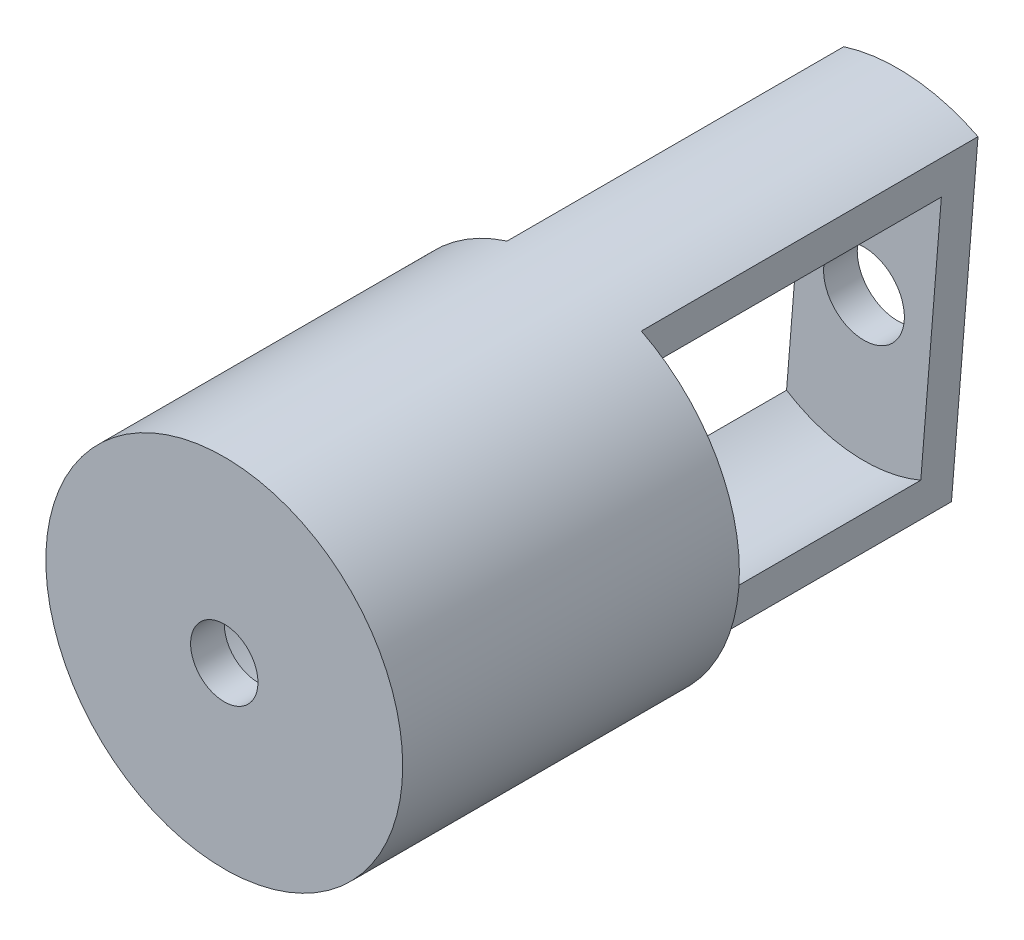
ISO-10303-21;
HEADER;
FILE_DESCRIPTION(('STEP AP214'),'2;1');
FILE_NAME('part.step','',(''),(''),'','','');
FILE_SCHEMA(('AUTOMOTIVE_DESIGN { 1 0 10303 214 1 1 1 1 }'));
ENDSEC;
DATA;
#1=APPLICATION_CONTEXT('core data for automotive mechanical design processes');
#2=APPLICATION_PROTOCOL_DEFINITION('international standard','automotive_design',2000,#1);
#3=PRODUCT_CONTEXT('',#1,'mechanical');
#4=PRODUCT('Part','Part','',(#3));
#5=PRODUCT_RELATED_PRODUCT_CATEGORY('part','',(#4));
#6=PRODUCT_DEFINITION_FORMATION('','',#4);
#7=PRODUCT_DEFINITION_CONTEXT('part definition',#1,'design');
#8=PRODUCT_DEFINITION('design','',#6,#7);
#9=PRODUCT_DEFINITION_SHAPE('','',#8);
#10=(LENGTH_UNIT() NAMED_UNIT(*) SI_UNIT(.MILLI.,.METRE.));
#11=(NAMED_UNIT(*) PLANE_ANGLE_UNIT() SI_UNIT($,.RADIAN.));
#12=(NAMED_UNIT(*) SI_UNIT($,.STERADIAN.) SOLID_ANGLE_UNIT());
#13=UNCERTAINTY_MEASURE_WITH_UNIT(LENGTH_MEASURE(1.E-05),#10,'distance_accuracy_value','');
#14=(GEOMETRIC_REPRESENTATION_CONTEXT(3) GLOBAL_UNCERTAINTY_ASSIGNED_CONTEXT((#13)) GLOBAL_UNIT_ASSIGNED_CONTEXT((#10,
#11,#12)) REPRESENTATION_CONTEXT('',''));
#15=CARTESIAN_POINT('',(0.,0.,0.));
#16=DIRECTION('',(0.,0.,1.));
#17=DIRECTION('',(1.,0.,0.));
#18=AXIS2_PLACEMENT_3D('',#15,#16,#17);
#19=CARTESIAN_POINT('',(0.,0.,-95.));
#20=DIRECTION('',(0.,0.,1.));
#21=DIRECTION('',(1.,0.,0.));
#22=AXIS2_PLACEMENT_3D('',#19,#20,#21);
#23=CYLINDRICAL_SURFACE('',#22,21.5);
#24=CARTESIAN_POINT('',(0.,0.,0.));
#25=DIRECTION('',(0.,0.,1.));
#26=DIRECTION('',(1.,0.,0.));
#27=AXIS2_PLACEMENT_3D('',#24,#25,#26);
#28=CIRCLE('',#27,21.5);
#29=CARTESIAN_POINT('',(21.5,0.,0.));
#30=VERTEX_POINT('',#29);
#31=EDGE_CURVE('E12',#30,#30,#28,.T.);
#32=ORIENTED_EDGE('',*,*,#31,.T.);
#33=EDGE_LOOP('',(#32));
#34=FACE_BOUND('',#33,.T.);
#35=CARTESIAN_POINT('',(0.,0.,-90.));
#36=DIRECTION('',(0.,0.,-1.));
#37=DIRECTION('',(-1.,0.,0.));
#38=AXIS2_PLACEMENT_3D('',#35,#36,#37);
#39=CIRCLE('',#38,21.5);
#40=CARTESIAN_POINT('',(-11.4948270092321,-18.1691758764075,-90.));
#41=VERTEX_POINT('',#40);
#42=CARTESIAN_POINT('',(8.4406955661325,-19.7738377246267,-90.));
#43=VERTEX_POINT('',#42);
#44=EDGE_CURVE('E56',#41,#43,#39,.F.);
#45=ORIENTED_EDGE('',*,*,#44,.F.);
#46=DIRECTION('',(0.,0.,-1.));
#47=VECTOR('',#46,1.);
#48=CARTESIAN_POINT('',(-11.4948270092321,-18.1691758764075,-45.));
#49=LINE('',#48,#47);
#50=CARTESIAN_POINT('',(-11.4948270092321,-18.1691758764075,-45.));
#51=VERTEX_POINT('',#50);
#52=EDGE_CURVE('E121',#51,#41,#49,.T.);
#53=ORIENTED_EDGE('',*,*,#52,.F.);
#54=CARTESIAN_POINT('',(0.,0.,-45.));
#55=DIRECTION('',(0.,0.,1.));
#56=DIRECTION('',(-1.,0.,0.));
#57=AXIS2_PLACEMENT_3D('',#54,#55,#56);
#58=CIRCLE('',#57,21.5);
#59=CARTESIAN_POINT('',(-8.4406955661325,19.7738377246267,-45.));
#60=VERTEX_POINT('',#59);
#61=EDGE_CURVE('E126',#60,#51,#58,.T.);
#62=ORIENTED_EDGE('',*,*,#61,.F.);
#63=DIRECTION('',(0.,0.,-1.));
#64=VECTOR('',#63,1.);
#65=CARTESIAN_POINT('',(-8.4406955661325,19.7738377246267,-45.));
#66=LINE('',#65,#64);
#67=CARTESIAN_POINT('',(-8.44069556613249,19.7738377246267,-90.));
#68=VERTEX_POINT('',#67);
#69=EDGE_CURVE('E119',#60,#68,#66,.T.);
#70=ORIENTED_EDGE('',*,*,#69,.T.);
#71=CARTESIAN_POINT('',(0.,0.,-90.));
#72=DIRECTION('',(0.,0.,-1.));
#73=DIRECTION('',(-1.,0.,0.));
#74=AXIS2_PLACEMENT_3D('',#71,#72,#73);
#75=CIRCLE('',#74,21.5);
#76=CARTESIAN_POINT('',(11.494827009232,18.1691758764075,-90.));
#77=VERTEX_POINT('',#76);
#78=EDGE_CURVE('E105',#68,#77,#75,.T.);
#79=ORIENTED_EDGE('',*,*,#78,.T.);
#80=DIRECTION('',(0.,0.,-1.));
#81=VECTOR('',#80,1.);
#82=CARTESIAN_POINT('',(11.494827009232,18.1691758764075,-45.));
#83=LINE('',#82,#81);
#84=CARTESIAN_POINT('',(11.494827009232,18.1691758764075,-45.));
#85=VERTEX_POINT('',#84);
#86=EDGE_CURVE('E204',#85,#77,#83,.T.);
#87=ORIENTED_EDGE('',*,*,#86,.F.);
#88=CARTESIAN_POINT('',(0.,0.,-45.));
#89=DIRECTION('',(0.,0.,1.));
#90=DIRECTION('',(-1.,0.,0.));
#91=AXIS2_PLACEMENT_3D('',#88,#89,#90);
#92=CIRCLE('',#91,21.5);
#93=CARTESIAN_POINT('',(8.4406955661325,-19.7738377246267,-45.));
#94=VERTEX_POINT('',#93);
#95=EDGE_CURVE('E223',#94,#85,#92,.T.);
#96=ORIENTED_EDGE('',*,*,#95,.F.);
#97=DIRECTION('',(0.,0.,-1.));
#98=VECTOR('',#97,1.);
#99=CARTESIAN_POINT('',(8.4406955661325,-19.7738377246267,-45.));
#100=LINE('',#99,#98);
#101=EDGE_CURVE('E61',#94,#43,#100,.T.);
#102=ORIENTED_EDGE('',*,*,#101,.T.);
#103=EDGE_LOOP('',(#45,#53,#62,#70,#79,#87,#96,#102));
#104=FACE_BOUND('',#103,.T.);
#105=ADVANCED_FACE('F41',(#34,#104),#23,.F.);
#106=CARTESIAN_POINT('',(0.,0.,5.));
#107=DIRECTION('',(0.,0.,1.));
#108=DIRECTION('',(1.,0.,0.));
#109=AXIS2_PLACEMENT_3D('',#106,#107,#108);
#110=PLANE('',#109);
#111=CARTESIAN_POINT('',(0.,0.,5.));
#112=DIRECTION('',(0.,0.,1.));
#113=DIRECTION('',(1.,0.,0.));
#114=AXIS2_PLACEMENT_3D('',#111,#112,#113);
#115=CIRCLE('',#114,5.);
#116=CARTESIAN_POINT('',(5.,0.,5.));
#117=VERTEX_POINT('',#116);
#118=EDGE_CURVE('E49',#117,#117,#115,.T.);
#119=ORIENTED_EDGE('',*,*,#118,.F.);
#120=EDGE_LOOP('',(#119));
#121=FACE_BOUND('',#120,.T.);
#122=CARTESIAN_POINT('',(0.,0.,5.));
#123=DIRECTION('',(0.,0.,1.));
#124=DIRECTION('',(1.,0.,0.));
#125=AXIS2_PLACEMENT_3D('',#122,#123,#124);
#126=CIRCLE('',#125,26.5);
#127=CARTESIAN_POINT('',(26.5,0.,5.));
#128=VERTEX_POINT('',#127);
#129=EDGE_CURVE('E147',#128,#128,#126,.T.);
#130=ORIENTED_EDGE('',*,*,#129,.T.);
#131=EDGE_LOOP('',(#130));
#132=FACE_BOUND('',#131,.T.);
#133=ADVANCED_FACE('F168',(#121,#132),#110,.T.);
#134=CARTESIAN_POINT('',(0.,0.,0.));
#135=DIRECTION('',(0.,0.,1.));
#136=DIRECTION('',(1.,0.,0.));
#137=AXIS2_PLACEMENT_3D('',#134,#135,#136);
#138=PLANE('',#137);
#139=ORIENTED_EDGE('',*,*,#31,.F.);
#140=EDGE_LOOP('',(#139));
#141=FACE_BOUND('',#140,.T.);
#142=CARTESIAN_POINT('',(0.,0.,0.));
#143=DIRECTION('',(0.,0.,1.));
#144=DIRECTION('',(1.,0.,0.));
#145=AXIS2_PLACEMENT_3D('',#142,#143,#144);
#146=CIRCLE('',#145,5.);
#147=CARTESIAN_POINT('',(5.,0.,0.));
#148=VERTEX_POINT('',#147);
#149=EDGE_CURVE('E145',#148,#148,#146,.T.);
#150=ORIENTED_EDGE('',*,*,#149,.T.);
#151=EDGE_LOOP('',(#150));
#152=FACE_BOUND('',#151,.T.);
#153=ADVANCED_FACE('F43',(#141,#152),#138,.F.);
#154=CARTESIAN_POINT('',(0.,0.,5.));
#155=DIRECTION('',(0.,0.,-1.));
#156=DIRECTION('',(-1.,0.,0.));
#157=AXIS2_PLACEMENT_3D('',#154,#155,#156);
#158=CYLINDRICAL_SURFACE('',#157,5.);
#159=ORIENTED_EDGE('',*,*,#118,.T.);
#160=EDGE_LOOP('',(#159));
#161=FACE_BOUND('',#160,.T.);
#162=ORIENTED_EDGE('',*,*,#149,.F.);
#163=EDGE_LOOP('',(#162));
#164=FACE_BOUND('',#163,.T.);
#165=ADVANCED_FACE('F156',(#161,#164),#158,.F.);
#166=CARTESIAN_POINT('',(0.,0.,-95.));
#167=DIRECTION('',(0.,0.,1.));
#168=DIRECTION('',(1.,0.,0.));
#169=AXIS2_PLACEMENT_3D('',#166,#167,#168);
#170=CYLINDRICAL_SURFACE('',#169,26.5);
#171=DIRECTION('',(0.,0.,-1.));
#172=VECTOR('',#171,1.);
#173=CARTESIAN_POINT('',(11.9367441485042,23.6593351371747,-45.));
#174=LINE('',#173,#172);
#175=CARTESIAN_POINT('',(11.9367441485042,23.6593351371747,-45.));
#176=VERTEX_POINT('',#175);
#177=CARTESIAN_POINT('',(11.9367441485042,23.6593351371747,-95.));
#178=VERTEX_POINT('',#177);
#179=EDGE_CURVE('E150',#176,#178,#174,.T.);
#180=ORIENTED_EDGE('',*,*,#179,.T.);
#181=CARTESIAN_POINT('',(0.,0.,-95.));
#182=DIRECTION('',(0.,0.,1.));
#183=DIRECTION('',(1.,0.,0.));
#184=AXIS2_PLACEMENT_3D('',#181,#182,#183);
#185=CIRCLE('',#184,26.5);
#186=CARTESIAN_POINT('',(-7.99877842686035,25.2639969853939,-95.));
#187=VERTEX_POINT('',#186);
#188=EDGE_CURVE('E142',#178,#187,#185,.T.);
#189=ORIENTED_EDGE('',*,*,#188,.T.);
#190=DIRECTION('',(0.,0.,-1.));
#191=VECTOR('',#190,1.);
#192=CARTESIAN_POINT('',(-7.99877842686035,25.2639969853939,-45.));
#193=LINE('',#192,#191);
#194=CARTESIAN_POINT('',(-7.99877842686035,25.2639969853939,-45.));
#195=VERTEX_POINT('',#194);
#196=EDGE_CURVE('E128',#195,#187,#193,.T.);
#197=ORIENTED_EDGE('',*,*,#196,.F.);
#198=CARTESIAN_POINT('',(0.,0.,-45.));
#199=DIRECTION('',(0.,0.,-1.));
#200=DIRECTION('',(-1.,0.,0.));
#201=AXIS2_PLACEMENT_3D('',#198,#199,#200);
#202=CIRCLE('',#201,26.5);
#203=CARTESIAN_POINT('',(-11.9367441485042,-23.6593351371747,-45.));
#204=VERTEX_POINT('',#203);
#205=EDGE_CURVE('E217',#204,#195,#202,.T.);
#206=ORIENTED_EDGE('',*,*,#205,.F.);
#207=DIRECTION('',(0.,0.,-1.));
#208=VECTOR('',#207,1.);
#209=CARTESIAN_POINT('',(-11.9367441485042,-23.6593351371747,-45.));
#210=LINE('',#209,#208);
#211=CARTESIAN_POINT('',(-11.9367441485042,-23.6593351371747,-95.));
#212=VERTEX_POINT('',#211);
#213=EDGE_CURVE('E132',#204,#212,#210,.T.);
#214=ORIENTED_EDGE('',*,*,#213,.T.);
#215=CARTESIAN_POINT('',(7.99877842686036,-25.2639969853939,-95.));
#216=VERTEX_POINT('',#215);
#217=EDGE_CURVE('E146',#212,#216,#185,.T.);
#218=ORIENTED_EDGE('',*,*,#217,.T.);
#219=DIRECTION('',(0.,0.,-1.));
#220=VECTOR('',#219,1.);
#221=CARTESIAN_POINT('',(7.99877842686036,-25.2639969853939,-45.));
#222=LINE('',#221,#220);
#223=CARTESIAN_POINT('',(7.99877842686036,-25.2639969853939,-45.));
#224=VERTEX_POINT('',#223);
#225=EDGE_CURVE('E210',#224,#216,#222,.T.);
#226=ORIENTED_EDGE('',*,*,#225,.F.);
#227=CARTESIAN_POINT('',(0.,0.,-45.));
#228=DIRECTION('',(0.,0.,-1.));
#229=DIRECTION('',(-1.,0.,0.));
#230=AXIS2_PLACEMENT_3D('',#227,#228,#229);
#231=CIRCLE('',#230,26.5);
#232=EDGE_CURVE('E130',#176,#224,#231,.T.);
#233=ORIENTED_EDGE('',*,*,#232,.F.);
#234=EDGE_LOOP('',(#180,#189,#197,#206,#214,#218,#226,#233));
#235=FACE_BOUND('',#234,.T.);
#236=ORIENTED_EDGE('',*,*,#129,.F.);
#237=EDGE_LOOP('',(#236));
#238=FACE_BOUND('',#237,.T.);
#239=ADVANCED_FACE('F158',(#235,#238),#170,.T.);
#240=CARTESIAN_POINT('',(0.,0.,-95.));
#241=DIRECTION('',(0.,0.,1.));
#242=DIRECTION('',(1.,0.,0.));
#243=AXIS2_PLACEMENT_3D('',#240,#241,#242);
#244=PLANE('',#243);
#245=CARTESIAN_POINT('',(0.,0.,-95.));
#246=DIRECTION('',(0.,0.,-1.));
#247=DIRECTION('',(-1.,0.,0.));
#248=AXIS2_PLACEMENT_3D('',#245,#246,#247);
#249=CIRCLE('',#248,6.);
#250=CARTESIAN_POINT('',(-6.,0.,-95.));
#251=VERTEX_POINT('',#250);
#252=EDGE_CURVE('E189',#251,#251,#249,.T.);
#253=ORIENTED_EDGE('',*,*,#252,.F.);
#254=EDGE_LOOP('',(#253));
#255=FACE_BOUND('',#254,.T.);
#256=DIRECTION('',(-0.0802330924109598,-0.996776128768228,0.));
#257=VECTOR('',#256,1.);
#258=CARTESIAN_POINT('',(-11.9367441485042,-23.6593351371747,-95.));
#259=LINE('',#258,#257);
#260=EDGE_CURVE('E135',#187,#212,#259,.T.);
#261=ORIENTED_EDGE('',*,*,#260,.F.);
#262=ORIENTED_EDGE('',*,*,#188,.F.);
#263=DIRECTION('',(0.0802330924109597,0.996776128768228,0.));
#264=VECTOR('',#263,1.);
#265=CARTESIAN_POINT('',(7.99877842686036,-25.2639969853939,-95.));
#266=LINE('',#265,#264);
#267=EDGE_CURVE('E127',#216,#178,#266,.T.);
#268=ORIENTED_EDGE('',*,*,#267,.F.);
#269=ORIENTED_EDGE('',*,*,#217,.F.);
#270=EDGE_LOOP('',(#261,#262,#268,#269));
#271=FACE_BOUND('',#270,.T.);
#272=ADVANCED_FACE('F165',(#255,#271),#244,.F.);
#273=CARTESIAN_POINT('',(-8.4406955661325,19.7738377246267,-45.));
#274=DIRECTION('',(0.996776128768228,-0.0802330924109604,0.));
#275=DIRECTION('',(0.0802330924109604,0.996776128768228,0.));
#276=AXIS2_PLACEMENT_3D('',#273,#274,#275);
#277=PLANE('',#276);
#278=ORIENTED_EDGE('',*,*,#196,.T.);
#279=ORIENTED_EDGE('',*,*,#260,.T.);
#280=ORIENTED_EDGE('',*,*,#213,.F.);
#281=DIRECTION('',(-0.0802330924109598,-0.996776128768228,0.));
#282=VECTOR('',#281,1.);
#283=CARTESIAN_POINT('',(-11.9367441485042,-23.6593351371747,-45.));
#284=LINE('',#283,#282);
#285=EDGE_CURVE('E214',#51,#204,#284,.T.);
#286=ORIENTED_EDGE('',*,*,#285,.F.);
#287=ORIENTED_EDGE('',*,*,#52,.T.);
#288=DIRECTION('',(0.08023309241096,0.996776128768228,0.));
#289=VECTOR('',#288,1.);
#290=CARTESIAN_POINT('',(-9.96776128768227,0.802330924109599,-90.));
#291=LINE('',#290,#289);
#292=EDGE_CURVE('E108',#41,#68,#291,.T.);
#293=ORIENTED_EDGE('',*,*,#292,.T.);
#294=ORIENTED_EDGE('',*,*,#69,.F.);
#295=DIRECTION('',(-0.0802330924109604,-0.996776128768228,0.));
#296=VECTOR('',#295,1.);
#297=CARTESIAN_POINT('',(-8.4406955661325,19.7738377246267,-45.));
#298=LINE('',#297,#296);
#299=EDGE_CURVE('E141',#195,#60,#298,.T.);
#300=ORIENTED_EDGE('',*,*,#299,.F.);
#301=EDGE_LOOP('',(#278,#279,#280,#286,#287,#293,#294,#300));
#302=FACE_BOUND('',#301,.T.);
#303=ADVANCED_FACE('F117',(#302),#277,.F.);
#304=CARTESIAN_POINT('',(0.,0.,-45.));
#305=DIRECTION('',(0.,0.,-1.));
#306=DIRECTION('',(-1.,0.,0.));
#307=AXIS2_PLACEMENT_3D('',#304,#305,#306);
#308=PLANE('',#307);
#309=ORIENTED_EDGE('',*,*,#61,.T.);
#310=ORIENTED_EDGE('',*,*,#285,.T.);
#311=ORIENTED_EDGE('',*,*,#205,.T.);
#312=ORIENTED_EDGE('',*,*,#299,.T.);
#313=EDGE_LOOP('',(#309,#310,#311,#312));
#314=FACE_BOUND('',#313,.T.);
#315=ADVANCED_FACE('F185',(#314),#308,.T.);
#316=CARTESIAN_POINT('',(11.494827009232,18.1691758764075,-45.));
#317=DIRECTION('',(-0.996776128768228,0.0802330924109597,0.));
#318=DIRECTION('',(-0.0802330924109597,-0.996776128768228,0.));
#319=AXIS2_PLACEMENT_3D('',#316,#317,#318);
#320=PLANE('',#319);
#321=ORIENTED_EDGE('',*,*,#267,.T.);
#322=ORIENTED_EDGE('',*,*,#179,.F.);
#323=DIRECTION('',(0.0802330924109597,0.996776128768228,0.));
#324=VECTOR('',#323,1.);
#325=CARTESIAN_POINT('',(11.494827009232,18.1691758764075,-45.));
#326=LINE('',#325,#324);
#327=EDGE_CURVE('E212',#85,#176,#326,.T.);
#328=ORIENTED_EDGE('',*,*,#327,.F.);
#329=ORIENTED_EDGE('',*,*,#86,.T.);
#330=DIRECTION('',(0.0802330924109596,0.996776128768228,0.));
#331=VECTOR('',#330,1.);
#332=CARTESIAN_POINT('',(9.96776128768227,-0.802330924109596,-90.));
#333=LINE('',#332,#331);
#334=EDGE_CURVE('E110',#43,#77,#333,.T.);
#335=ORIENTED_EDGE('',*,*,#334,.F.);
#336=ORIENTED_EDGE('',*,*,#101,.F.);
#337=DIRECTION('',(0.0802330924109597,0.996776128768228,0.));
#338=VECTOR('',#337,1.);
#339=CARTESIAN_POINT('',(7.99877842686036,-25.2639969853939,-45.));
#340=LINE('',#339,#338);
#341=EDGE_CURVE('E221',#224,#94,#340,.T.);
#342=ORIENTED_EDGE('',*,*,#341,.F.);
#343=ORIENTED_EDGE('',*,*,#225,.T.);
#344=EDGE_LOOP('',(#321,#322,#328,#329,#335,#336,#342,#343));
#345=FACE_BOUND('',#344,.T.);
#346=ADVANCED_FACE('F219',(#345),#320,.F.);
#347=CARTESIAN_POINT('',(0.,0.,-45.));
#348=DIRECTION('',(0.,0.,-1.));
#349=DIRECTION('',(-1.,0.,0.));
#350=AXIS2_PLACEMENT_3D('',#347,#348,#349);
#351=PLANE('',#350);
#352=ORIENTED_EDGE('',*,*,#232,.T.);
#353=ORIENTED_EDGE('',*,*,#341,.T.);
#354=ORIENTED_EDGE('',*,*,#95,.T.);
#355=ORIENTED_EDGE('',*,*,#327,.T.);
#356=EDGE_LOOP('',(#352,#353,#354,#355));
#357=FACE_BOUND('',#356,.T.);
#358=ADVANCED_FACE('F225',(#357),#351,.T.);
#359=CARTESIAN_POINT('',(0.,0.,-90.));
#360=DIRECTION('',(0.,0.,-1.));
#361=DIRECTION('',(-1.,0.,0.));
#362=AXIS2_PLACEMENT_3D('',#359,#360,#361);
#363=PLANE('',#362);
#364=CARTESIAN_POINT('',(0.,0.,-90.));
#365=DIRECTION('',(0.,0.,-1.));
#366=DIRECTION('',(-1.,0.,0.));
#367=AXIS2_PLACEMENT_3D('',#364,#365,#366);
#368=CIRCLE('',#367,6.);
#369=CARTESIAN_POINT('',(-6.,0.,-90.));
#370=VERTEX_POINT('',#369);
#371=EDGE_CURVE('E122',#370,#370,#368,.T.);
#372=ORIENTED_EDGE('',*,*,#371,.T.);
#373=EDGE_LOOP('',(#372));
#374=FACE_BOUND('',#373,.T.);
#375=ORIENTED_EDGE('',*,*,#292,.F.);
#376=ORIENTED_EDGE('',*,*,#44,.T.);
#377=ORIENTED_EDGE('',*,*,#334,.T.);
#378=ORIENTED_EDGE('',*,*,#78,.F.);
#379=EDGE_LOOP('',(#375,#376,#377,#378));
#380=FACE_BOUND('',#379,.T.);
#381=ADVANCED_FACE('F107',(#374,#380),#363,.F.);
#382=CARTESIAN_POINT('',(0.,0.,-90.));
#383=DIRECTION('',(0.,0.,-1.));
#384=DIRECTION('',(-1.,0.,0.));
#385=AXIS2_PLACEMENT_3D('',#382,#383,#384);
#386=CYLINDRICAL_SURFACE('',#385,6.);
#387=ORIENTED_EDGE('',*,*,#371,.F.);
#388=EDGE_LOOP('',(#387));
#389=FACE_BOUND('',#388,.T.);
#390=ORIENTED_EDGE('',*,*,#252,.T.);
#391=EDGE_LOOP('',(#390));
#392=FACE_BOUND('',#391,.T.);
#393=ADVANCED_FACE('F236',(#389,#392),#386,.F.);
#394=CLOSED_SHELL('',(#105,#133,#153,#165,#239,#272,#303,#315,#346,#358,#381,#393));
#395=MANIFOLD_SOLID_BREP('B2',#394);
#396=ADVANCED_BREP_SHAPE_REPRESENTATION('',(#18,#395),#14);
#397=SHAPE_DEFINITION_REPRESENTATION(#9,#396);
ENDSEC;
END-ISO-10303-21;
